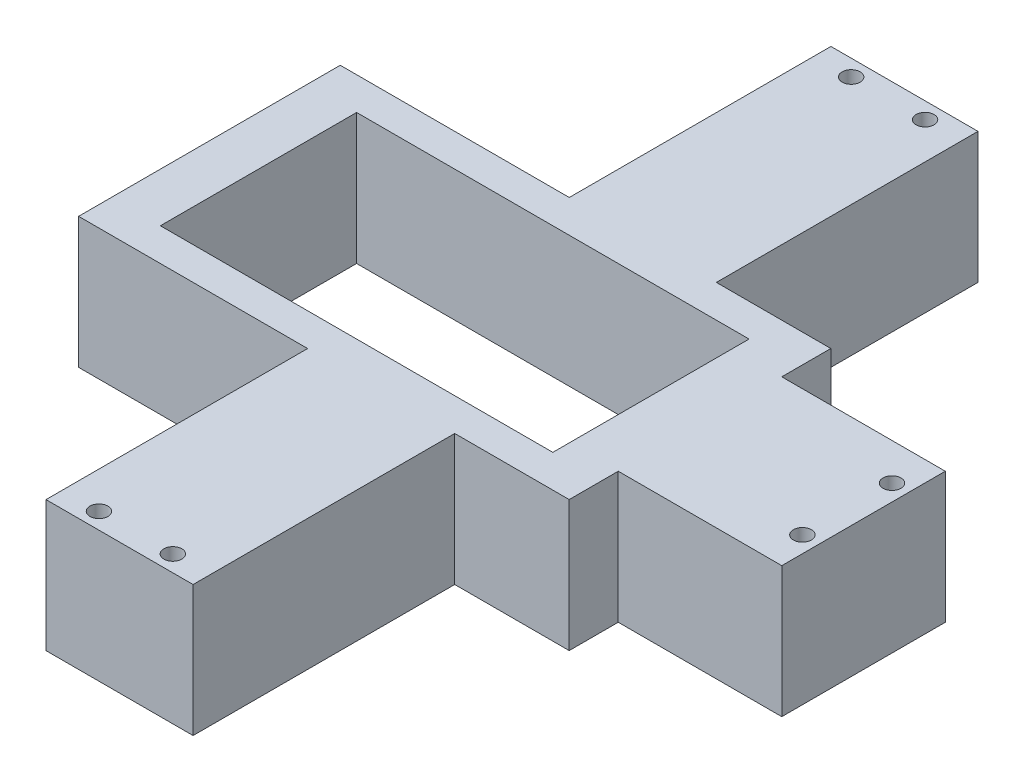
ISO-10303-21;
HEADER;
FILE_DESCRIPTION(('STEP AP214'),'2;1');
FILE_NAME('part.step','',(''),(''),'','','');
FILE_SCHEMA(('AUTOMOTIVE_DESIGN { 1 0 10303 214 1 1 1 1 }'));
ENDSEC;
DATA;
#1=APPLICATION_CONTEXT('core data for automotive mechanical design processes');
#2=APPLICATION_PROTOCOL_DEFINITION('international standard','automotive_design',2000,#1);
#3=PRODUCT_CONTEXT('',#1,'mechanical');
#4=PRODUCT('Part','Part','',(#3));
#5=PRODUCT_RELATED_PRODUCT_CATEGORY('part','',(#4));
#6=PRODUCT_DEFINITION_FORMATION('','',#4);
#7=PRODUCT_DEFINITION_CONTEXT('part definition',#1,'design');
#8=PRODUCT_DEFINITION('design','',#6,#7);
#9=PRODUCT_DEFINITION_SHAPE('','',#8);
#10=(LENGTH_UNIT() NAMED_UNIT(*) SI_UNIT(.MILLI.,.METRE.));
#11=(NAMED_UNIT(*) PLANE_ANGLE_UNIT() SI_UNIT($,.RADIAN.));
#12=(NAMED_UNIT(*) SI_UNIT($,.STERADIAN.) SOLID_ANGLE_UNIT());
#13=UNCERTAINTY_MEASURE_WITH_UNIT(LENGTH_MEASURE(1.E-05),#10,'distance_accuracy_value','');
#14=(GEOMETRIC_REPRESENTATION_CONTEXT(3) GLOBAL_UNCERTAINTY_ASSIGNED_CONTEXT((#13)) GLOBAL_UNIT_ASSIGNED_CONTEXT((#10,
#11,#12)) REPRESENTATION_CONTEXT('',''));
#15=CARTESIAN_POINT('',(0.,0.,0.));
#16=DIRECTION('',(0.,0.,1.));
#17=DIRECTION('',(1.,0.,0.));
#18=AXIS2_PLACEMENT_3D('',#15,#16,#17);
#19=CARTESIAN_POINT('',(57.5,20.,-40.));
#20=DIRECTION('',(0.,0.,-1.));
#21=DIRECTION('',(-1.,0.,0.));
#22=AXIS2_PLACEMENT_3D('',#19,#20,#21);
#23=PLANE('',#22);
#24=DIRECTION('',(1.,0.,0.));
#25=VECTOR('',#24,1.);
#26=CARTESIAN_POINT('',(57.5,0.,-40.));
#27=LINE('',#26,#25);
#28=CARTESIAN_POINT('',(57.5,0.,-40.));
#29=VERTEX_POINT('',#28);
#30=CARTESIAN_POINT('',(75.,0.,-40.));
#31=VERTEX_POINT('',#30);
#32=EDGE_CURVE('E297',#29,#31,#27,.T.);
#33=ORIENTED_EDGE('',*,*,#32,.F.);
#34=DIRECTION('',(0.,-1.,0.));
#35=VECTOR('',#34,1.);
#36=CARTESIAN_POINT('',(57.5,20.,-40.));
#37=LINE('',#36,#35);
#38=CARTESIAN_POINT('',(57.5,20.,-40.));
#39=VERTEX_POINT('',#38);
#40=EDGE_CURVE('E11',#39,#29,#37,.T.);
#41=ORIENTED_EDGE('',*,*,#40,.F.);
#42=DIRECTION('',(1.,0.,0.));
#43=VECTOR('',#42,1.);
#44=CARTESIAN_POINT('',(57.5,20.,-40.));
#45=LINE('',#44,#43);
#46=CARTESIAN_POINT('',(75.,20.,-40.));
#47=VERTEX_POINT('',#46);
#48=EDGE_CURVE('E298',#39,#47,#45,.T.);
#49=ORIENTED_EDGE('',*,*,#48,.T.);
#50=DIRECTION('',(0.,-1.,0.));
#51=VECTOR('',#50,1.);
#52=CARTESIAN_POINT('',(75.,20.,-40.));
#53=LINE('',#52,#51);
#54=EDGE_CURVE('E48',#47,#31,#53,.T.);
#55=ORIENTED_EDGE('',*,*,#54,.T.);
#56=EDGE_LOOP('',(#33,#41,#49,#55));
#57=FACE_BOUND('',#56,.T.);
#58=ADVANCED_FACE('F45',(#57),#23,.T.);
#59=CARTESIAN_POINT('',(57.5,20.,-80.));
#60=DIRECTION('',(1.,0.,0.));
#61=DIRECTION('',(0.,0.,-1.));
#62=AXIS2_PLACEMENT_3D('',#59,#60,#61);
#63=PLANE('',#62);
#64=DIRECTION('',(0.,0.,1.));
#65=VECTOR('',#64,1.);
#66=CARTESIAN_POINT('',(57.5,0.,-80.));
#67=LINE('',#66,#65);
#68=CARTESIAN_POINT('',(57.5,0.,-80.));
#69=VERTEX_POINT('',#68);
#70=EDGE_CURVE('E303',#69,#29,#67,.T.);
#71=ORIENTED_EDGE('',*,*,#70,.F.);
#72=DIRECTION('',(0.,-1.,0.));
#73=VECTOR('',#72,1.);
#74=CARTESIAN_POINT('',(57.5,20.,-80.));
#75=LINE('',#74,#73);
#76=CARTESIAN_POINT('',(57.5,20.,-80.));
#77=VERTEX_POINT('',#76);
#78=EDGE_CURVE('E54',#77,#69,#75,.T.);
#79=ORIENTED_EDGE('',*,*,#78,.F.);
#80=DIRECTION('',(0.,0.,1.));
#81=VECTOR('',#80,1.);
#82=CARTESIAN_POINT('',(57.5,20.,-80.));
#83=LINE('',#82,#81);
#84=EDGE_CURVE('E352',#77,#39,#83,.T.);
#85=ORIENTED_EDGE('',*,*,#84,.T.);
#86=ORIENTED_EDGE('',*,*,#40,.T.);
#87=EDGE_LOOP('',(#71,#79,#85,#86));
#88=FACE_BOUND('',#87,.T.);
#89=ADVANCED_FACE('F472',(#88),#63,.T.);
#90=CARTESIAN_POINT('',(35.0130425407911,20.,-80.));
#91=DIRECTION('',(0.,0.,-1.));
#92=DIRECTION('',(-1.,0.,0.));
#93=AXIS2_PLACEMENT_3D('',#90,#91,#92);
#94=PLANE('',#93);
#95=DIRECTION('',(1.,0.,0.));
#96=VECTOR('',#95,1.);
#97=CARTESIAN_POINT('',(35.0130425407911,0.,-80.));
#98=LINE('',#97,#96);
#99=CARTESIAN_POINT('',(35.0130425407911,0.,-80.));
#100=VERTEX_POINT('',#99);
#101=EDGE_CURVE('E408',#100,#69,#98,.T.);
#102=ORIENTED_EDGE('',*,*,#101,.F.);
#103=DIRECTION('',(0.,-1.,0.));
#104=VECTOR('',#103,1.);
#105=CARTESIAN_POINT('',(35.0130425407911,20.,-80.));
#106=LINE('',#105,#104);
#107=CARTESIAN_POINT('',(35.0130425407911,20.,-80.));
#108=VERTEX_POINT('',#107);
#109=EDGE_CURVE('E417',#108,#100,#106,.T.);
#110=ORIENTED_EDGE('',*,*,#109,.F.);
#111=DIRECTION('',(1.,0.,0.));
#112=VECTOR('',#111,1.);
#113=CARTESIAN_POINT('',(35.0130425407911,20.,-80.));
#114=LINE('',#113,#112);
#115=EDGE_CURVE('E348',#108,#77,#114,.T.);
#116=ORIENTED_EDGE('',*,*,#115,.T.);
#117=ORIENTED_EDGE('',*,*,#78,.T.);
#118=EDGE_LOOP('',(#102,#110,#116,#117));
#119=FACE_BOUND('',#118,.T.);
#120=ADVANCED_FACE('F530',(#119),#94,.T.);
#121=CARTESIAN_POINT('',(35.0130425407911,20.,-80.));
#122=DIRECTION('',(1.,0.,0.));
#123=DIRECTION('',(0.,0.,-1.));
#124=AXIS2_PLACEMENT_3D('',#121,#122,#123);
#125=PLANE('',#124);
#126=DIRECTION('',(0.,0.,1.));
#127=VECTOR('',#126,1.);
#128=CARTESIAN_POINT('',(35.0130425407911,0.,-80.));
#129=LINE('',#128,#127);
#130=CARTESIAN_POINT('',(35.0130425407911,0.,-40.));
#131=VERTEX_POINT('',#130);
#132=EDGE_CURVE('E404',#100,#131,#129,.T.);
#133=ORIENTED_EDGE('',*,*,#132,.T.);
#134=DIRECTION('',(0.,-1.,0.));
#135=VECTOR('',#134,1.);
#136=CARTESIAN_POINT('',(35.0130425407911,20.,-40.));
#137=LINE('',#136,#135);
#138=CARTESIAN_POINT('',(35.0130425407911,20.,-40.));
#139=VERTEX_POINT('',#138);
#140=EDGE_CURVE('E420',#139,#131,#137,.T.);
#141=ORIENTED_EDGE('',*,*,#140,.F.);
#142=DIRECTION('',(0.,0.,1.));
#143=VECTOR('',#142,1.);
#144=CARTESIAN_POINT('',(35.0130425407911,20.,-80.));
#145=LINE('',#144,#143);
#146=EDGE_CURVE('E345',#108,#139,#145,.T.);
#147=ORIENTED_EDGE('',*,*,#146,.F.);
#148=ORIENTED_EDGE('',*,*,#109,.T.);
#149=EDGE_LOOP('',(#133,#141,#147,#148));
#150=FACE_BOUND('',#149,.T.);
#151=ADVANCED_FACE('F528',(#150),#125,.F.);
#152=CARTESIAN_POINT('',(0.,20.,-40.));
#153=DIRECTION('',(0.,0.,-1.));
#154=DIRECTION('',(-1.,0.,0.));
#155=AXIS2_PLACEMENT_3D('',#152,#153,#154);
#156=PLANE('',#155);
#157=DIRECTION('',(1.,0.,0.));
#158=VECTOR('',#157,1.);
#159=CARTESIAN_POINT('',(0.,0.,-40.));
#160=LINE('',#159,#158);
#161=CARTESIAN_POINT('',(0.,0.,-40.));
#162=VERTEX_POINT('',#161);
#163=EDGE_CURVE('E400',#162,#131,#160,.T.);
#164=ORIENTED_EDGE('',*,*,#163,.F.);
#165=DIRECTION('',(0.,-1.,0.));
#166=VECTOR('',#165,1.);
#167=CARTESIAN_POINT('',(0.,20.,-40.));
#168=LINE('',#167,#166);
#169=CARTESIAN_POINT('',(0.,20.,-40.));
#170=VERTEX_POINT('',#169);
#171=EDGE_CURVE('E423',#170,#162,#168,.T.);
#172=ORIENTED_EDGE('',*,*,#171,.F.);
#173=DIRECTION('',(1.,0.,0.));
#174=VECTOR('',#173,1.);
#175=CARTESIAN_POINT('',(0.,20.,-40.));
#176=LINE('',#175,#174);
#177=EDGE_CURVE('E341',#170,#139,#176,.T.);
#178=ORIENTED_EDGE('',*,*,#177,.T.);
#179=ORIENTED_EDGE('',*,*,#140,.T.);
#180=EDGE_LOOP('',(#164,#172,#178,#179));
#181=FACE_BOUND('',#180,.T.);
#182=ADVANCED_FACE('F524',(#181),#156,.T.);
#183=CARTESIAN_POINT('',(0.,20.,-40.));
#184=DIRECTION('',(1.,0.,0.));
#185=DIRECTION('',(0.,0.,-1.));
#186=AXIS2_PLACEMENT_3D('',#183,#184,#185);
#187=PLANE('',#186);
#188=DIRECTION('',(0.,0.,1.));
#189=VECTOR('',#188,1.);
#190=CARTESIAN_POINT('',(0.,0.,-40.));
#191=LINE('',#190,#189);
#192=CARTESIAN_POINT('',(0.,0.,0.));
#193=VERTEX_POINT('',#192);
#194=EDGE_CURVE('E397',#162,#193,#191,.T.);
#195=ORIENTED_EDGE('',*,*,#194,.T.);
#196=DIRECTION('',(0.,-1.,0.));
#197=VECTOR('',#196,1.);
#198=CARTESIAN_POINT('',(0.,20.,0.));
#199=LINE('',#198,#197);
#200=CARTESIAN_POINT('',(0.,20.,0.));
#201=VERTEX_POINT('',#200);
#202=EDGE_CURVE('E426',#201,#193,#199,.T.);
#203=ORIENTED_EDGE('',*,*,#202,.F.);
#204=DIRECTION('',(0.,0.,1.));
#205=VECTOR('',#204,1.);
#206=CARTESIAN_POINT('',(0.,20.,-40.));
#207=LINE('',#206,#205);
#208=EDGE_CURVE('E338',#170,#201,#207,.T.);
#209=ORIENTED_EDGE('',*,*,#208,.F.);
#210=ORIENTED_EDGE('',*,*,#171,.T.);
#211=EDGE_LOOP('',(#195,#203,#209,#210));
#212=FACE_BOUND('',#211,.T.);
#213=ADVANCED_FACE('F520',(#212),#187,.F.);
#214=CARTESIAN_POINT('',(0.,20.,0.));
#215=DIRECTION('',(0.,0.,-1.));
#216=DIRECTION('',(-1.,0.,0.));
#217=AXIS2_PLACEMENT_3D('',#214,#215,#216);
#218=PLANE('',#217);
#219=DIRECTION('',(1.,0.,0.));
#220=VECTOR('',#219,1.);
#221=CARTESIAN_POINT('',(0.,0.,0.));
#222=LINE('',#221,#220);
#223=CARTESIAN_POINT('',(35.0130425407911,0.,0.));
#224=VERTEX_POINT('',#223);
#225=EDGE_CURVE('E394',#193,#224,#222,.T.);
#226=ORIENTED_EDGE('',*,*,#225,.T.);
#227=DIRECTION('',(0.,-1.,0.));
#228=VECTOR('',#227,1.);
#229=CARTESIAN_POINT('',(35.0130425407911,20.,0.));
#230=LINE('',#229,#228);
#231=CARTESIAN_POINT('',(35.0130425407911,20.,0.));
#232=VERTEX_POINT('',#231);
#233=EDGE_CURVE('E430',#232,#224,#230,.T.);
#234=ORIENTED_EDGE('',*,*,#233,.F.);
#235=DIRECTION('',(1.,0.,0.));
#236=VECTOR('',#235,1.);
#237=CARTESIAN_POINT('',(0.,20.,0.));
#238=LINE('',#237,#236);
#239=EDGE_CURVE('E335',#201,#232,#238,.T.);
#240=ORIENTED_EDGE('',*,*,#239,.F.);
#241=ORIENTED_EDGE('',*,*,#202,.T.);
#242=EDGE_LOOP('',(#226,#234,#240,#241));
#243=FACE_BOUND('',#242,.T.);
#244=ADVANCED_FACE('F516',(#243),#218,.F.);
#245=CARTESIAN_POINT('',(35.0130425407911,20.,0.));
#246=DIRECTION('',(1.,0.,0.));
#247=DIRECTION('',(0.,0.,-1.));
#248=AXIS2_PLACEMENT_3D('',#245,#246,#247);
#249=PLANE('',#248);
#250=DIRECTION('',(0.,0.,1.));
#251=VECTOR('',#250,1.);
#252=CARTESIAN_POINT('',(35.0130425407911,0.,0.));
#253=LINE('',#252,#251);
#254=CARTESIAN_POINT('',(35.0130425407911,0.,40.));
#255=VERTEX_POINT('',#254);
#256=EDGE_CURVE('E391',#224,#255,#253,.T.);
#257=ORIENTED_EDGE('',*,*,#256,.T.);
#258=DIRECTION('',(0.,-1.,0.));
#259=VECTOR('',#258,1.);
#260=CARTESIAN_POINT('',(35.0130425407911,20.,40.));
#261=LINE('',#260,#259);
#262=CARTESIAN_POINT('',(35.0130425407911,20.,40.));
#263=VERTEX_POINT('',#262);
#264=EDGE_CURVE('E434',#263,#255,#261,.T.);
#265=ORIENTED_EDGE('',*,*,#264,.F.);
#266=DIRECTION('',(0.,0.,1.));
#267=VECTOR('',#266,1.);
#268=CARTESIAN_POINT('',(35.0130425407911,20.,0.));
#269=LINE('',#268,#267);
#270=EDGE_CURVE('E332',#232,#263,#269,.T.);
#271=ORIENTED_EDGE('',*,*,#270,.F.);
#272=ORIENTED_EDGE('',*,*,#233,.T.);
#273=EDGE_LOOP('',(#257,#265,#271,#272));
#274=FACE_BOUND('',#273,.T.);
#275=ADVANCED_FACE('F511',(#274),#249,.F.);
#276=CARTESIAN_POINT('',(35.0130425407911,20.,40.));
#277=DIRECTION('',(0.,0.,-1.));
#278=DIRECTION('',(-1.,0.,0.));
#279=AXIS2_PLACEMENT_3D('',#276,#277,#278);
#280=PLANE('',#279);
#281=DIRECTION('',(1.,0.,0.));
#282=VECTOR('',#281,1.);
#283=CARTESIAN_POINT('',(35.0130425407911,0.,40.));
#284=LINE('',#283,#282);
#285=CARTESIAN_POINT('',(57.5,0.,40.));
#286=VERTEX_POINT('',#285);
#287=EDGE_CURVE('E387',#255,#286,#284,.T.);
#288=ORIENTED_EDGE('',*,*,#287,.T.);
#289=DIRECTION('',(0.,-1.,0.));
#290=VECTOR('',#289,1.);
#291=CARTESIAN_POINT('',(57.5,20.,40.));
#292=LINE('',#291,#290);
#293=CARTESIAN_POINT('',(57.5,20.,40.));
#294=VERTEX_POINT('',#293);
#295=EDGE_CURVE('E438',#294,#286,#292,.T.);
#296=ORIENTED_EDGE('',*,*,#295,.F.);
#297=DIRECTION('',(1.,0.,0.));
#298=VECTOR('',#297,1.);
#299=CARTESIAN_POINT('',(35.0130425407911,20.,40.));
#300=LINE('',#299,#298);
#301=EDGE_CURVE('E329',#263,#294,#300,.T.);
#302=ORIENTED_EDGE('',*,*,#301,.F.);
#303=ORIENTED_EDGE('',*,*,#264,.T.);
#304=EDGE_LOOP('',(#288,#296,#302,#303));
#305=FACE_BOUND('',#304,.T.);
#306=ADVANCED_FACE('F505',(#305),#280,.F.);
#307=CARTESIAN_POINT('',(57.5,20.,0.));
#308=DIRECTION('',(1.,0.,0.));
#309=DIRECTION('',(0.,0.,-1.));
#310=AXIS2_PLACEMENT_3D('',#307,#308,#309);
#311=PLANE('',#310);
#312=DIRECTION('',(0.,0.,1.));
#313=VECTOR('',#312,1.);
#314=CARTESIAN_POINT('',(57.5,0.,0.));
#315=LINE('',#314,#313);
#316=CARTESIAN_POINT('',(57.5,0.,0.));
#317=VERTEX_POINT('',#316);
#318=EDGE_CURVE('E383',#317,#286,#315,.T.);
#319=ORIENTED_EDGE('',*,*,#318,.F.);
#320=DIRECTION('',(0.,-1.,0.));
#321=VECTOR('',#320,1.);
#322=CARTESIAN_POINT('',(57.5,20.,0.));
#323=LINE('',#322,#321);
#324=CARTESIAN_POINT('',(57.5,20.,0.));
#325=VERTEX_POINT('',#324);
#326=EDGE_CURVE('E441',#325,#317,#323,.T.);
#327=ORIENTED_EDGE('',*,*,#326,.F.);
#328=DIRECTION('',(0.,0.,1.));
#329=VECTOR('',#328,1.);
#330=CARTESIAN_POINT('',(57.5,20.,0.));
#331=LINE('',#330,#329);
#332=EDGE_CURVE('E325',#325,#294,#331,.T.);
#333=ORIENTED_EDGE('',*,*,#332,.T.);
#334=ORIENTED_EDGE('',*,*,#295,.T.);
#335=EDGE_LOOP('',(#319,#327,#333,#334));
#336=FACE_BOUND('',#335,.T.);
#337=ADVANCED_FACE('F499',(#336),#311,.T.);
#338=CARTESIAN_POINT('',(57.5,20.,0.));
#339=DIRECTION('',(0.,0.,-1.));
#340=DIRECTION('',(-1.,0.,0.));
#341=AXIS2_PLACEMENT_3D('',#338,#339,#340);
#342=PLANE('',#341);
#343=DIRECTION('',(1.,0.,0.));
#344=VECTOR('',#343,1.);
#345=CARTESIAN_POINT('',(57.5,0.,0.));
#346=LINE('',#345,#344);
#347=CARTESIAN_POINT('',(75.,0.,0.));
#348=VERTEX_POINT('',#347);
#349=EDGE_CURVE('E379',#317,#348,#346,.T.);
#350=ORIENTED_EDGE('',*,*,#349,.T.);
#351=DIRECTION('',(0.,-1.,0.));
#352=VECTOR('',#351,1.);
#353=CARTESIAN_POINT('',(75.,20.,0.));
#354=LINE('',#353,#352);
#355=CARTESIAN_POINT('',(75.,20.,0.));
#356=VERTEX_POINT('',#355);
#357=EDGE_CURVE('E444',#356,#348,#354,.T.);
#358=ORIENTED_EDGE('',*,*,#357,.F.);
#359=DIRECTION('',(1.,0.,0.));
#360=VECTOR('',#359,1.);
#361=CARTESIAN_POINT('',(57.5,20.,0.));
#362=LINE('',#361,#360);
#363=EDGE_CURVE('E322',#325,#356,#362,.T.);
#364=ORIENTED_EDGE('',*,*,#363,.F.);
#365=ORIENTED_EDGE('',*,*,#326,.T.);
#366=EDGE_LOOP('',(#350,#358,#364,#365));
#367=FACE_BOUND('',#366,.T.);
#368=ADVANCED_FACE('F531',(#367),#342,.F.);
#369=CARTESIAN_POINT('',(75.,20.,-7.5));
#370=DIRECTION('',(1.,0.,0.));
#371=DIRECTION('',(0.,0.,-1.));
#372=AXIS2_PLACEMENT_3D('',#369,#370,#371);
#373=PLANE('',#372);
#374=DIRECTION('',(0.,0.,1.));
#375=VECTOR('',#374,1.);
#376=CARTESIAN_POINT('',(75.,0.,-7.5));
#377=LINE('',#376,#375);
#378=CARTESIAN_POINT('',(75.,0.,-7.5));
#379=VERTEX_POINT('',#378);
#380=EDGE_CURVE('E375',#379,#348,#377,.T.);
#381=ORIENTED_EDGE('',*,*,#380,.F.);
#382=DIRECTION('',(0.,-1.,0.));
#383=VECTOR('',#382,1.);
#384=CARTESIAN_POINT('',(75.,20.,-7.5));
#385=LINE('',#384,#383);
#386=CARTESIAN_POINT('',(75.,20.,-7.5));
#387=VERTEX_POINT('',#386);
#388=EDGE_CURVE('E447',#387,#379,#385,.T.);
#389=ORIENTED_EDGE('',*,*,#388,.F.);
#390=DIRECTION('',(0.,0.,1.));
#391=VECTOR('',#390,1.);
#392=CARTESIAN_POINT('',(75.,20.,-7.5));
#393=LINE('',#392,#391);
#394=EDGE_CURVE('E318',#387,#356,#393,.T.);
#395=ORIENTED_EDGE('',*,*,#394,.T.);
#396=ORIENTED_EDGE('',*,*,#357,.T.);
#397=EDGE_LOOP('',(#381,#389,#395,#396));
#398=FACE_BOUND('',#397,.T.);
#399=ADVANCED_FACE('F492',(#398),#373,.T.);
#400=CARTESIAN_POINT('',(75.,20.,-7.5));
#401=DIRECTION('',(0.,0.,-1.));
#402=DIRECTION('',(-1.,0.,0.));
#403=AXIS2_PLACEMENT_3D('',#400,#401,#402);
#404=PLANE('',#403);
#405=DIRECTION('',(1.,0.,0.));
#406=VECTOR('',#405,1.);
#407=CARTESIAN_POINT('',(75.,0.,-7.5));
#408=LINE('',#407,#406);
#409=CARTESIAN_POINT('',(100.,0.,-7.5));
#410=VERTEX_POINT('',#409);
#411=EDGE_CURVE('E371',#379,#410,#408,.T.);
#412=ORIENTED_EDGE('',*,*,#411,.T.);
#413=DIRECTION('',(0.,-1.,0.));
#414=VECTOR('',#413,1.);
#415=CARTESIAN_POINT('',(100.,20.,-7.5));
#416=LINE('',#415,#414);
#417=CARTESIAN_POINT('',(100.,20.,-7.5));
#418=VERTEX_POINT('',#417);
#419=EDGE_CURVE('E450',#418,#410,#416,.T.);
#420=ORIENTED_EDGE('',*,*,#419,.F.);
#421=DIRECTION('',(1.,0.,0.));
#422=VECTOR('',#421,1.);
#423=CARTESIAN_POINT('',(75.,20.,-7.5));
#424=LINE('',#423,#422);
#425=EDGE_CURVE('E315',#387,#418,#424,.T.);
#426=ORIENTED_EDGE('',*,*,#425,.F.);
#427=ORIENTED_EDGE('',*,*,#388,.T.);
#428=EDGE_LOOP('',(#412,#420,#426,#427));
#429=FACE_BOUND('',#428,.T.);
#430=ADVANCED_FACE('F489',(#429),#404,.F.);
#431=CARTESIAN_POINT('',(100.,20.,-32.5));
#432=DIRECTION('',(1.,0.,0.));
#433=DIRECTION('',(0.,0.,-1.));
#434=AXIS2_PLACEMENT_3D('',#431,#432,#433);
#435=PLANE('',#434);
#436=DIRECTION('',(0.,0.,1.));
#437=VECTOR('',#436,1.);
#438=CARTESIAN_POINT('',(100.,0.,-32.5));
#439=LINE('',#438,#437);
#440=CARTESIAN_POINT('',(100.,0.,-32.5));
#441=VERTEX_POINT('',#440);
#442=EDGE_CURVE('E367',#441,#410,#439,.T.);
#443=ORIENTED_EDGE('',*,*,#442,.F.);
#444=DIRECTION('',(0.,-1.,0.));
#445=VECTOR('',#444,1.);
#446=CARTESIAN_POINT('',(100.,20.,-32.5));
#447=LINE('',#446,#445);
#448=CARTESIAN_POINT('',(100.,20.,-32.5));
#449=VERTEX_POINT('',#448);
#450=EDGE_CURVE('E453',#449,#441,#447,.T.);
#451=ORIENTED_EDGE('',*,*,#450,.F.);
#452=DIRECTION('',(0.,0.,1.));
#453=VECTOR('',#452,1.);
#454=CARTESIAN_POINT('',(100.,20.,-32.5));
#455=LINE('',#454,#453);
#456=EDGE_CURVE('E311',#449,#418,#455,.T.);
#457=ORIENTED_EDGE('',*,*,#456,.T.);
#458=ORIENTED_EDGE('',*,*,#419,.T.);
#459=EDGE_LOOP('',(#443,#451,#457,#458));
#460=FACE_BOUND('',#459,.T.);
#461=ADVANCED_FACE('F485',(#460),#435,.T.);
#462=CARTESIAN_POINT('',(75.,20.,-32.5));
#463=DIRECTION('',(0.,0.,-1.));
#464=DIRECTION('',(-1.,0.,0.));
#465=AXIS2_PLACEMENT_3D('',#462,#463,#464);
#466=PLANE('',#465);
#467=DIRECTION('',(1.,0.,0.));
#468=VECTOR('',#467,1.);
#469=CARTESIAN_POINT('',(75.,0.,-32.5));
#470=LINE('',#469,#468);
#471=CARTESIAN_POINT('',(75.,0.,-32.5));
#472=VERTEX_POINT('',#471);
#473=EDGE_CURVE('E363',#472,#441,#470,.T.);
#474=ORIENTED_EDGE('',*,*,#473,.F.);
#475=DIRECTION('',(0.,-1.,0.));
#476=VECTOR('',#475,1.);
#477=CARTESIAN_POINT('',(75.,20.,-32.5));
#478=LINE('',#477,#476);
#479=CARTESIAN_POINT('',(75.,20.,-32.5));
#480=VERTEX_POINT('',#479);
#481=EDGE_CURVE('E455',#480,#472,#478,.T.);
#482=ORIENTED_EDGE('',*,*,#481,.F.);
#483=DIRECTION('',(1.,0.,0.));
#484=VECTOR('',#483,1.);
#485=CARTESIAN_POINT('',(75.,20.,-32.5));
#486=LINE('',#485,#484);
#487=EDGE_CURVE('E307',#480,#449,#486,.T.);
#488=ORIENTED_EDGE('',*,*,#487,.T.);
#489=ORIENTED_EDGE('',*,*,#450,.T.);
#490=EDGE_LOOP('',(#474,#482,#488,#489));
#491=FACE_BOUND('',#490,.T.);
#492=ADVANCED_FACE('F480',(#491),#466,.T.);
#493=CARTESIAN_POINT('',(75.,20.,-40.));
#494=DIRECTION('',(1.,0.,0.));
#495=DIRECTION('',(0.,0.,-1.));
#496=AXIS2_PLACEMENT_3D('',#493,#494,#495);
#497=PLANE('',#496);
#498=DIRECTION('',(0.,0.,1.));
#499=VECTOR('',#498,1.);
#500=CARTESIAN_POINT('',(75.,0.,-40.));
#501=LINE('',#500,#499);
#502=EDGE_CURVE('E359',#31,#472,#501,.T.);
#503=ORIENTED_EDGE('',*,*,#502,.F.);
#504=ORIENTED_EDGE('',*,*,#54,.F.);
#505=DIRECTION('',(0.,0.,1.));
#506=VECTOR('',#505,1.);
#507=CARTESIAN_POINT('',(75.,20.,-40.));
#508=LINE('',#507,#506);
#509=EDGE_CURVE('E302',#47,#480,#508,.T.);
#510=ORIENTED_EDGE('',*,*,#509,.T.);
#511=ORIENTED_EDGE('',*,*,#481,.T.);
#512=EDGE_LOOP('',(#503,#504,#510,#511));
#513=FACE_BOUND('',#512,.T.);
#514=ADVANCED_FACE('F465',(#513),#497,.T.);
#515=CARTESIAN_POINT('',(0.,20.,0.));
#516=DIRECTION('',(0.,-1.,0.));
#517=DIRECTION('',(0.,0.,-1.));
#518=AXIS2_PLACEMENT_3D('',#515,#516,#517);
#519=PLANE('',#518);
#520=CARTESIAN_POINT('',(40.6065212703955,20.,37.5));
#521=DIRECTION('',(0.,1.,0.));
#522=DIRECTION('',(0.,0.,1.));
#523=AXIS2_PLACEMENT_3D('',#520,#521,#522);
#524=CIRCLE('',#523,1.375);
#525=CARTESIAN_POINT('',(40.6065212703955,20.,38.875));
#526=VERTEX_POINT('',#525);
#527=EDGE_CURVE('E212',#526,#526,#524,.T.);
#528=ORIENTED_EDGE('',*,*,#527,.F.);
#529=EDGE_LOOP('',(#528));
#530=FACE_BOUND('',#529,.T.);
#531=CARTESIAN_POINT('',(51.9065212703956,20.,37.5));
#532=DIRECTION('',(0.,1.,0.));
#533=DIRECTION('',(0.,0.,1.));
#534=AXIS2_PLACEMENT_3D('',#531,#532,#533);
#535=CIRCLE('',#534,1.375);
#536=CARTESIAN_POINT('',(51.9065212703956,20.,38.875));
#537=VERTEX_POINT('',#536);
#538=EDGE_CURVE('E211',#537,#537,#535,.T.);
#539=ORIENTED_EDGE('',*,*,#538,.F.);
#540=EDGE_LOOP('',(#539));
#541=FACE_BOUND('',#540,.T.);
#542=CARTESIAN_POINT('',(97.5,20.,-13.15));
#543=DIRECTION('',(0.,1.,0.));
#544=DIRECTION('',(0.,0.,1.));
#545=AXIS2_PLACEMENT_3D('',#542,#543,#544);
#546=CIRCLE('',#545,1.375);
#547=CARTESIAN_POINT('',(97.5,20.,-11.775));
#548=VERTEX_POINT('',#547);
#549=EDGE_CURVE('E225',#548,#548,#546,.T.);
#550=ORIENTED_EDGE('',*,*,#549,.F.);
#551=EDGE_LOOP('',(#550));
#552=FACE_BOUND('',#551,.T.);
#553=CARTESIAN_POINT('',(97.5,20.,-26.85));
#554=DIRECTION('',(0.,1.,0.));
#555=DIRECTION('',(0.,0.,1.));
#556=AXIS2_PLACEMENT_3D('',#553,#554,#555);
#557=CIRCLE('',#556,1.375);
#558=CARTESIAN_POINT('',(97.5,20.,-25.475));
#559=VERTEX_POINT('',#558);
#560=EDGE_CURVE('E233',#559,#559,#557,.T.);
#561=ORIENTED_EDGE('',*,*,#560,.F.);
#562=EDGE_LOOP('',(#561));
#563=FACE_BOUND('',#562,.T.);
#564=CARTESIAN_POINT('',(40.6065212703956,20.,-77.5));
#565=DIRECTION('',(0.,1.,0.));
#566=DIRECTION('',(0.,0.,1.));
#567=AXIS2_PLACEMENT_3D('',#564,#565,#566);
#568=CIRCLE('',#567,1.375);
#569=CARTESIAN_POINT('',(40.6065212703956,20.,-76.125));
#570=VERTEX_POINT('',#569);
#571=EDGE_CURVE('E241',#570,#570,#568,.T.);
#572=ORIENTED_EDGE('',*,*,#571,.F.);
#573=EDGE_LOOP('',(#572));
#574=FACE_BOUND('',#573,.T.);
#575=CARTESIAN_POINT('',(51.9065212703956,20.,-77.5));
#576=DIRECTION('',(0.,1.,0.));
#577=DIRECTION('',(0.,0.,1.));
#578=AXIS2_PLACEMENT_3D('',#575,#576,#577);
#579=CIRCLE('',#578,1.375);
#580=CARTESIAN_POINT('',(51.9065212703956,20.,-76.125));
#581=VERTEX_POINT('',#580);
#582=EDGE_CURVE('E249',#581,#581,#579,.T.);
#583=ORIENTED_EDGE('',*,*,#582,.F.);
#584=EDGE_LOOP('',(#583));
#585=FACE_BOUND('',#584,.T.);
#586=DIRECTION('',(1.,0.,0.));
#587=VECTOR('',#586,1.);
#588=CARTESIAN_POINT('',(7.5,20.,-5.));
#589=LINE('',#588,#587);
#590=CARTESIAN_POINT('',(7.5,20.,-5.));
#591=VERTEX_POINT('',#590);
#592=CARTESIAN_POINT('',(67.5,20.,-5.));
#593=VERTEX_POINT('',#592);
#594=EDGE_CURVE('E271',#591,#593,#589,.T.);
#595=ORIENTED_EDGE('',*,*,#594,.F.);
#596=DIRECTION('',(0.,0.,1.));
#597=VECTOR('',#596,1.);
#598=CARTESIAN_POINT('',(7.5,20.,-35.));
#599=LINE('',#598,#597);
#600=CARTESIAN_POINT('',(7.5,20.,-35.));
#601=VERTEX_POINT('',#600);
#602=EDGE_CURVE('E62',#601,#591,#599,.T.);
#603=ORIENTED_EDGE('',*,*,#602,.F.);
#604=DIRECTION('',(-1.,0.,0.));
#605=VECTOR('',#604,1.);
#606=CARTESIAN_POINT('',(7.5,20.,-35.));
#607=LINE('',#606,#605);
#608=CARTESIAN_POINT('',(67.5,20.,-35.));
#609=VERTEX_POINT('',#608);
#610=EDGE_CURVE('E278',#609,#601,#607,.T.);
#611=ORIENTED_EDGE('',*,*,#610,.F.);
#612=DIRECTION('',(0.,0.,-1.));
#613=VECTOR('',#612,1.);
#614=CARTESIAN_POINT('',(67.5,20.,-35.));
#615=LINE('',#614,#613);
#616=EDGE_CURVE('E274',#593,#609,#615,.T.);
#617=ORIENTED_EDGE('',*,*,#616,.F.);
#618=EDGE_LOOP('',(#595,#603,#611,#617));
#619=FACE_BOUND('',#618,.T.);
#620=ORIENTED_EDGE('',*,*,#48,.F.);
#621=ORIENTED_EDGE('',*,*,#84,.F.);
#622=ORIENTED_EDGE('',*,*,#115,.F.);
#623=ORIENTED_EDGE('',*,*,#146,.T.);
#624=ORIENTED_EDGE('',*,*,#177,.F.);
#625=ORIENTED_EDGE('',*,*,#208,.T.);
#626=ORIENTED_EDGE('',*,*,#239,.T.);
#627=ORIENTED_EDGE('',*,*,#270,.T.);
#628=ORIENTED_EDGE('',*,*,#301,.T.);
#629=ORIENTED_EDGE('',*,*,#332,.F.);
#630=ORIENTED_EDGE('',*,*,#363,.T.);
#631=ORIENTED_EDGE('',*,*,#394,.F.);
#632=ORIENTED_EDGE('',*,*,#425,.T.);
#633=ORIENTED_EDGE('',*,*,#456,.F.);
#634=ORIENTED_EDGE('',*,*,#487,.F.);
#635=ORIENTED_EDGE('',*,*,#509,.F.);
#636=EDGE_LOOP('',(#620,#621,#622,#623,#624,#625,#626,#627,#628,#629,#630,#631,#632,#633,#634,#635));
#637=FACE_BOUND('',#636,.T.);
#638=ADVANCED_FACE('F475',(#530,#541,#552,#563,#574,#585,#619,#637),#519,.F.);
#639=CARTESIAN_POINT('',(0.,0.,0.));
#640=DIRECTION('',(0.,-1.,0.));
#641=DIRECTION('',(0.,0.,-1.));
#642=AXIS2_PLACEMENT_3D('',#639,#640,#641);
#643=PLANE('',#642);
#644=DIRECTION('',(0.,0.,1.));
#645=VECTOR('',#644,1.);
#646=CARTESIAN_POINT('',(7.5,0.,-35.));
#647=LINE('',#646,#645);
#648=CARTESIAN_POINT('',(7.5,0.,-35.));
#649=VERTEX_POINT('',#648);
#650=CARTESIAN_POINT('',(7.5,0.,-5.));
#651=VERTEX_POINT('',#650);
#652=EDGE_CURVE('E265',#649,#651,#647,.T.);
#653=ORIENTED_EDGE('',*,*,#652,.T.);
#654=DIRECTION('',(1.,0.,0.));
#655=VECTOR('',#654,1.);
#656=CARTESIAN_POINT('',(7.5,0.,-5.));
#657=LINE('',#656,#655);
#658=CARTESIAN_POINT('',(67.5,0.,-5.));
#659=VERTEX_POINT('',#658);
#660=EDGE_CURVE('E286',#651,#659,#657,.T.);
#661=ORIENTED_EDGE('',*,*,#660,.T.);
#662=DIRECTION('',(0.,0.,-1.));
#663=VECTOR('',#662,1.);
#664=CARTESIAN_POINT('',(67.5,0.,-35.));
#665=LINE('',#664,#663);
#666=CARTESIAN_POINT('',(67.5,0.,-35.));
#667=VERTEX_POINT('',#666);
#668=EDGE_CURVE('E257',#659,#667,#665,.T.);
#669=ORIENTED_EDGE('',*,*,#668,.T.);
#670=DIRECTION('',(-1.,0.,0.));
#671=VECTOR('',#670,1.);
#672=CARTESIAN_POINT('',(7.5,0.,-35.));
#673=LINE('',#672,#671);
#674=EDGE_CURVE('E261',#667,#649,#673,.T.);
#675=ORIENTED_EDGE('',*,*,#674,.T.);
#676=EDGE_LOOP('',(#653,#661,#669,#675));
#677=FACE_BOUND('',#676,.T.);
#678=ORIENTED_EDGE('',*,*,#32,.T.);
#679=ORIENTED_EDGE('',*,*,#502,.T.);
#680=ORIENTED_EDGE('',*,*,#473,.T.);
#681=ORIENTED_EDGE('',*,*,#442,.T.);
#682=ORIENTED_EDGE('',*,*,#411,.F.);
#683=ORIENTED_EDGE('',*,*,#380,.T.);
#684=ORIENTED_EDGE('',*,*,#349,.F.);
#685=ORIENTED_EDGE('',*,*,#318,.T.);
#686=ORIENTED_EDGE('',*,*,#287,.F.);
#687=ORIENTED_EDGE('',*,*,#256,.F.);
#688=ORIENTED_EDGE('',*,*,#225,.F.);
#689=ORIENTED_EDGE('',*,*,#194,.F.);
#690=ORIENTED_EDGE('',*,*,#163,.T.);
#691=ORIENTED_EDGE('',*,*,#132,.F.);
#692=ORIENTED_EDGE('',*,*,#101,.T.);
#693=ORIENTED_EDGE('',*,*,#70,.T.);
#694=EDGE_LOOP('',(#678,#679,#680,#681,#682,#683,#684,#685,#686,#687,#688,#689,#690,#691,#692,#693));
#695=FACE_BOUND('',#694,.T.);
#696=ADVANCED_FACE('F467',(#677,#695),#643,.T.);
#697=CARTESIAN_POINT('',(7.5,-0.001000000000001,-35.));
#698=DIRECTION('',(-1.,0.,0.));
#699=DIRECTION('',(0.,0.,1.));
#700=AXIS2_PLACEMENT_3D('',#697,#698,#699);
#701=PLANE('',#700);
#702=DIRECTION('',(0.,1.,0.));
#703=VECTOR('',#702,1.);
#704=CARTESIAN_POINT('',(7.5,-0.001000000000001,-35.));
#705=LINE('',#704,#703);
#706=EDGE_CURVE('E283',#649,#601,#705,.T.);
#707=ORIENTED_EDGE('',*,*,#706,.T.);
#708=ORIENTED_EDGE('',*,*,#602,.T.);
#709=DIRECTION('',(0.,1.,0.));
#710=VECTOR('',#709,1.);
#711=CARTESIAN_POINT('',(7.5,-0.001000000000001,-5.));
#712=LINE('',#711,#710);
#713=EDGE_CURVE('E282',#651,#591,#712,.T.);
#714=ORIENTED_EDGE('',*,*,#713,.F.);
#715=ORIENTED_EDGE('',*,*,#652,.F.);
#716=EDGE_LOOP('',(#707,#708,#714,#715));
#717=FACE_BOUND('',#716,.T.);
#718=ADVANCED_FACE('F633',(#717),#701,.F.);
#719=CARTESIAN_POINT('',(7.5,-0.001000000000001,-35.));
#720=DIRECTION('',(0.,0.,-1.));
#721=DIRECTION('',(-1.,0.,0.));
#722=AXIS2_PLACEMENT_3D('',#719,#720,#721);
#723=PLANE('',#722);
#724=DIRECTION('',(0.,1.,0.));
#725=VECTOR('',#724,1.);
#726=CARTESIAN_POINT('',(67.5,-0.001000000000001,-35.));
#727=LINE('',#726,#725);
#728=EDGE_CURVE('E287',#667,#609,#727,.T.);
#729=ORIENTED_EDGE('',*,*,#728,.T.);
#730=ORIENTED_EDGE('',*,*,#610,.T.);
#731=ORIENTED_EDGE('',*,*,#706,.F.);
#732=ORIENTED_EDGE('',*,*,#674,.F.);
#733=EDGE_LOOP('',(#729,#730,#731,#732));
#734=FACE_BOUND('',#733,.T.);
#735=ADVANCED_FACE('F642',(#734),#723,.F.);
#736=CARTESIAN_POINT('',(67.5,-0.001000000000001,-35.));
#737=DIRECTION('',(1.,0.,0.));
#738=DIRECTION('',(0.,0.,-1.));
#739=AXIS2_PLACEMENT_3D('',#736,#737,#738);
#740=PLANE('',#739);
#741=DIRECTION('',(0.,1.,0.));
#742=VECTOR('',#741,1.);
#743=CARTESIAN_POINT('',(67.5,-0.001000000000001,-5.));
#744=LINE('',#743,#742);
#745=EDGE_CURVE('E70',#659,#593,#744,.T.);
#746=ORIENTED_EDGE('',*,*,#745,.T.);
#747=ORIENTED_EDGE('',*,*,#616,.T.);
#748=ORIENTED_EDGE('',*,*,#728,.F.);
#749=ORIENTED_EDGE('',*,*,#668,.F.);
#750=EDGE_LOOP('',(#746,#747,#748,#749));
#751=FACE_BOUND('',#750,.T.);
#752=ADVANCED_FACE('F651',(#751),#740,.F.);
#753=CARTESIAN_POINT('',(7.5,-0.001000000000001,-5.));
#754=DIRECTION('',(0.,0.,1.));
#755=DIRECTION('',(1.,0.,0.));
#756=AXIS2_PLACEMENT_3D('',#753,#754,#755);
#757=PLANE('',#756);
#758=ORIENTED_EDGE('',*,*,#713,.T.);
#759=ORIENTED_EDGE('',*,*,#594,.T.);
#760=ORIENTED_EDGE('',*,*,#745,.F.);
#761=ORIENTED_EDGE('',*,*,#660,.F.);
#762=EDGE_LOOP('',(#758,#759,#760,#761));
#763=FACE_BOUND('',#762,.T.);
#764=ADVANCED_FACE('F661',(#763),#757,.F.);
#765=CARTESIAN_POINT('',(51.9065212703956,10.,-77.5));
#766=DIRECTION('',(0.,1.,0.));
#767=DIRECTION('',(0.,0.,1.));
#768=AXIS2_PLACEMENT_3D('',#765,#766,#767);
#769=CONICAL_SURFACE('',#768,1.37499999999999,1.02974425867665);
#770=CARTESIAN_POINT('',(51.9065212703956,9.1738166488371,-77.5));
#771=VERTEX_POINT('',#770);
#772=VERTEX_LOOP('',#771);
#773=FACE_BOUND('',#772,.T.);
#774=CARTESIAN_POINT('',(51.9065212703956,10.,-77.5));
#775=DIRECTION('',(0.,1.,0.));
#776=DIRECTION('',(0.,0.,1.));
#777=AXIS2_PLACEMENT_3D('',#774,#775,#776);
#778=CIRCLE('',#777,1.37499999999999);
#779=CARTESIAN_POINT('',(51.9065212703956,10.,-76.125));
#780=VERTEX_POINT('',#779);
#781=EDGE_CURVE('E253',#780,#780,#778,.T.);
#782=ORIENTED_EDGE('',*,*,#781,.T.);
#783=EDGE_LOOP('',(#782));
#784=FACE_BOUND('',#783,.T.);
#785=ADVANCED_FACE('F670',(#773,#784),#769,.F.);
#786=CARTESIAN_POINT('',(51.9065212703956,20.,-77.5));
#787=DIRECTION('',(0.,1.,0.));
#788=DIRECTION('',(0.,0.,1.));
#789=AXIS2_PLACEMENT_3D('',#786,#787,#788);
#790=CYLINDRICAL_SURFACE('',#789,1.375);
#791=ORIENTED_EDGE('',*,*,#781,.F.);
#792=EDGE_LOOP('',(#791));
#793=FACE_BOUND('',#792,.T.);
#794=ORIENTED_EDGE('',*,*,#582,.T.);
#795=EDGE_LOOP('',(#794));
#796=FACE_BOUND('',#795,.T.);
#797=ADVANCED_FACE('F678',(#793,#796),#790,.F.);
#798=CARTESIAN_POINT('',(40.6065212703956,10.,-77.5));
#799=DIRECTION('',(0.,1.,0.));
#800=DIRECTION('',(0.,0.,1.));
#801=AXIS2_PLACEMENT_3D('',#798,#799,#800);
#802=CONICAL_SURFACE('',#801,1.37499999999999,1.02974425867665);
#803=CARTESIAN_POINT('',(40.6065212703956,9.1738166488371,-77.5));
#804=VERTEX_POINT('',#803);
#805=VERTEX_LOOP('',#804);
#806=FACE_BOUND('',#805,.T.);
#807=CARTESIAN_POINT('',(40.6065212703956,10.,-77.5));
#808=DIRECTION('',(0.,1.,0.));
#809=DIRECTION('',(0.,0.,1.));
#810=AXIS2_PLACEMENT_3D('',#807,#808,#809);
#811=CIRCLE('',#810,1.37499999999999);
#812=CARTESIAN_POINT('',(40.6065212703956,10.,-76.125));
#813=VERTEX_POINT('',#812);
#814=EDGE_CURVE('E245',#813,#813,#811,.T.);
#815=ORIENTED_EDGE('',*,*,#814,.T.);
#816=EDGE_LOOP('',(#815));
#817=FACE_BOUND('',#816,.T.);
#818=ADVANCED_FACE('F688',(#806,#817),#802,.F.);
#819=CARTESIAN_POINT('',(40.6065212703956,20.,-77.5));
#820=DIRECTION('',(0.,1.,0.));
#821=DIRECTION('',(0.,0.,1.));
#822=AXIS2_PLACEMENT_3D('',#819,#820,#821);
#823=CYLINDRICAL_SURFACE('',#822,1.375);
#824=ORIENTED_EDGE('',*,*,#814,.F.);
#825=EDGE_LOOP('',(#824));
#826=FACE_BOUND('',#825,.T.);
#827=ORIENTED_EDGE('',*,*,#571,.T.);
#828=EDGE_LOOP('',(#827));
#829=FACE_BOUND('',#828,.T.);
#830=ADVANCED_FACE('F698',(#826,#829),#823,.F.);
#831=CARTESIAN_POINT('',(97.5,10.,-26.85));
#832=DIRECTION('',(0.,1.,0.));
#833=DIRECTION('',(0.,0.,1.));
#834=AXIS2_PLACEMENT_3D('',#831,#832,#833);
#835=CONICAL_SURFACE('',#834,1.375,1.02974425867665);
#836=CARTESIAN_POINT('',(97.5,9.1738166488371,-26.85));
#837=VERTEX_POINT('',#836);
#838=VERTEX_LOOP('',#837);
#839=FACE_BOUND('',#838,.T.);
#840=CARTESIAN_POINT('',(97.5,10.,-26.85));
#841=DIRECTION('',(0.,1.,0.));
#842=DIRECTION('',(0.,0.,1.));
#843=AXIS2_PLACEMENT_3D('',#840,#841,#842);
#844=CIRCLE('',#843,1.375);
#845=CARTESIAN_POINT('',(97.5,10.,-25.475));
#846=VERTEX_POINT('',#845);
#847=EDGE_CURVE('E237',#846,#846,#844,.T.);
#848=ORIENTED_EDGE('',*,*,#847,.T.);
#849=EDGE_LOOP('',(#848));
#850=FACE_BOUND('',#849,.T.);
#851=ADVANCED_FACE('F708',(#839,#850),#835,.F.);
#852=CARTESIAN_POINT('',(97.5,20.,-26.85));
#853=DIRECTION('',(0.,1.,0.));
#854=DIRECTION('',(0.,0.,1.));
#855=AXIS2_PLACEMENT_3D('',#852,#853,#854);
#856=CYLINDRICAL_SURFACE('',#855,1.375);
#857=ORIENTED_EDGE('',*,*,#847,.F.);
#858=EDGE_LOOP('',(#857));
#859=FACE_BOUND('',#858,.T.);
#860=ORIENTED_EDGE('',*,*,#560,.T.);
#861=EDGE_LOOP('',(#860));
#862=FACE_BOUND('',#861,.T.);
#863=ADVANCED_FACE('F718',(#859,#862),#856,.F.);
#864=CARTESIAN_POINT('',(97.5,10.,-13.15));
#865=DIRECTION('',(0.,1.,0.));
#866=DIRECTION('',(0.,0.,1.));
#867=AXIS2_PLACEMENT_3D('',#864,#865,#866);
#868=CONICAL_SURFACE('',#867,1.375,1.02974425867665);
#869=CARTESIAN_POINT('',(97.5,9.1738166488371,-13.15));
#870=VERTEX_POINT('',#869);
#871=VERTEX_LOOP('',#870);
#872=FACE_BOUND('',#871,.T.);
#873=CARTESIAN_POINT('',(97.5,10.,-13.15));
#874=DIRECTION('',(0.,1.,0.));
#875=DIRECTION('',(0.,0.,1.));
#876=AXIS2_PLACEMENT_3D('',#873,#874,#875);
#877=CIRCLE('',#876,1.375);
#878=CARTESIAN_POINT('',(97.5,10.,-11.775));
#879=VERTEX_POINT('',#878);
#880=EDGE_CURVE('E229',#879,#879,#877,.T.);
#881=ORIENTED_EDGE('',*,*,#880,.T.);
#882=EDGE_LOOP('',(#881));
#883=FACE_BOUND('',#882,.T.);
#884=ADVANCED_FACE('F728',(#872,#883),#868,.F.);
#885=CARTESIAN_POINT('',(97.5,20.,-13.15));
#886=DIRECTION('',(0.,1.,0.));
#887=DIRECTION('',(0.,0.,1.));
#888=AXIS2_PLACEMENT_3D('',#885,#886,#887);
#889=CYLINDRICAL_SURFACE('',#888,1.375);
#890=ORIENTED_EDGE('',*,*,#880,.F.);
#891=EDGE_LOOP('',(#890));
#892=FACE_BOUND('',#891,.T.);
#893=ORIENTED_EDGE('',*,*,#549,.T.);
#894=EDGE_LOOP('',(#893));
#895=FACE_BOUND('',#894,.T.);
#896=ADVANCED_FACE('F738',(#892,#895),#889,.F.);
#897=CARTESIAN_POINT('',(51.9065212703956,10.,37.5));
#898=DIRECTION('',(0.,1.,0.));
#899=DIRECTION('',(0.,0.,1.));
#900=AXIS2_PLACEMENT_3D('',#897,#898,#899);
#901=CONICAL_SURFACE('',#900,1.37499999999999,1.02974425867665);
#902=CARTESIAN_POINT('',(51.9065212703956,9.1738166488371,37.5));
#903=VERTEX_POINT('',#902);
#904=VERTEX_LOOP('',#903);
#905=FACE_BOUND('',#904,.T.);
#906=CARTESIAN_POINT('',(51.9065212703956,10.,37.5));
#907=DIRECTION('',(0.,1.,0.));
#908=DIRECTION('',(0.,0.,1.));
#909=AXIS2_PLACEMENT_3D('',#906,#907,#908);
#910=CIRCLE('',#909,1.37499999999999);
#911=CARTESIAN_POINT('',(51.9065212703956,10.,38.875));
#912=VERTEX_POINT('',#911);
#913=EDGE_CURVE('E217',#912,#912,#910,.T.);
#914=ORIENTED_EDGE('',*,*,#913,.T.);
#915=EDGE_LOOP('',(#914));
#916=FACE_BOUND('',#915,.T.);
#917=ADVANCED_FACE('F748',(#905,#916),#901,.F.);
#918=CARTESIAN_POINT('',(51.9065212703956,20.,37.5));
#919=DIRECTION('',(0.,1.,0.));
#920=DIRECTION('',(0.,0.,1.));
#921=AXIS2_PLACEMENT_3D('',#918,#919,#920);
#922=CYLINDRICAL_SURFACE('',#921,1.375);
#923=ORIENTED_EDGE('',*,*,#913,.F.);
#924=EDGE_LOOP('',(#923));
#925=FACE_BOUND('',#924,.T.);
#926=ORIENTED_EDGE('',*,*,#538,.T.);
#927=EDGE_LOOP('',(#926));
#928=FACE_BOUND('',#927,.T.);
#929=ADVANCED_FACE('F204',(#925,#928),#922,.F.);
#930=CARTESIAN_POINT('',(40.6065212703955,10.,37.5));
#931=DIRECTION('',(0.,1.,0.));
#932=DIRECTION('',(0.,0.,1.));
#933=AXIS2_PLACEMENT_3D('',#930,#931,#932);
#934=CONICAL_SURFACE('',#933,1.37499999999999,1.02974425867665);
#935=CARTESIAN_POINT('',(40.6065212703955,9.1738166488371,37.5));
#936=VERTEX_POINT('',#935);
#937=VERTEX_LOOP('',#936);
#938=FACE_BOUND('',#937,.T.);
#939=CARTESIAN_POINT('',(40.6065212703955,10.,37.5));
#940=DIRECTION('',(0.,1.,0.));
#941=DIRECTION('',(0.,0.,1.));
#942=AXIS2_PLACEMENT_3D('',#939,#940,#941);
#943=CIRCLE('',#942,1.37499999999999);
#944=CARTESIAN_POINT('',(40.6065212703955,10.,38.875));
#945=VERTEX_POINT('',#944);
#946=EDGE_CURVE('E208',#945,#945,#943,.T.);
#947=ORIENTED_EDGE('',*,*,#946,.T.);
#948=EDGE_LOOP('',(#947));
#949=FACE_BOUND('',#948,.T.);
#950=ADVANCED_FACE('F200',(#938,#949),#934,.F.);
#951=CARTESIAN_POINT('',(40.6065212703955,20.,37.5));
#952=DIRECTION('',(0.,1.,0.));
#953=DIRECTION('',(0.,0.,1.));
#954=AXIS2_PLACEMENT_3D('',#951,#952,#953);
#955=CYLINDRICAL_SURFACE('',#954,1.375);
#956=ORIENTED_EDGE('',*,*,#946,.F.);
#957=EDGE_LOOP('',(#956));
#958=FACE_BOUND('',#957,.T.);
#959=ORIENTED_EDGE('',*,*,#527,.T.);
#960=EDGE_LOOP('',(#959));
#961=FACE_BOUND('',#960,.T.);
#962=ADVANCED_FACE('F203',(#958,#961),#955,.F.);
#963=CLOSED_SHELL('',(#58,#89,#120,#151,#182,#213,#244,#275,#306,#337,#368,#399,#430,#461,#492,
#514,#638,#696,#718,#735,#752,#764,#785,#797,#818,#830,#851,#863,#884,#896,#917,#929,#950,#962));
#964=MANIFOLD_SOLID_BREP('B2',#963);
#965=ADVANCED_BREP_SHAPE_REPRESENTATION('',(#18,#964),#14);
#966=SHAPE_DEFINITION_REPRESENTATION(#9,#965);
ENDSEC;
END-ISO-10303-21;
